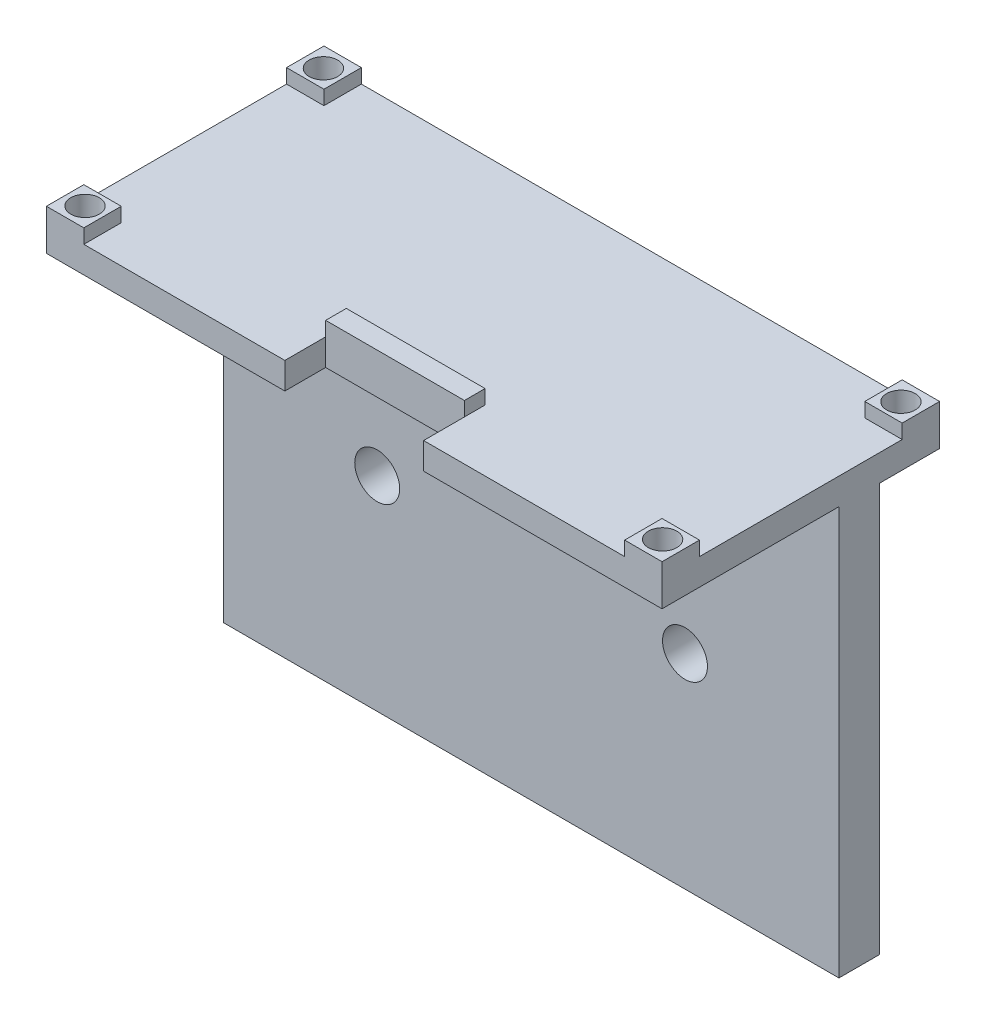
ISO-10303-21;
HEADER;
FILE_DESCRIPTION(('STEP AP214'),'2;1');
FILE_NAME('part.step','',(''),(''),'','','');
FILE_SCHEMA(('AUTOMOTIVE_DESIGN { 1 0 10303 214 1 1 1 1 }'));
ENDSEC;
DATA;
#1=APPLICATION_CONTEXT('core data for automotive mechanical design processes');
#2=APPLICATION_PROTOCOL_DEFINITION('international standard','automotive_design',2000,#1);
#3=PRODUCT_CONTEXT('',#1,'mechanical');
#4=PRODUCT('Part','Part','',(#3));
#5=PRODUCT_RELATED_PRODUCT_CATEGORY('part','',(#4));
#6=PRODUCT_DEFINITION_FORMATION('','',#4);
#7=PRODUCT_DEFINITION_CONTEXT('part definition',#1,'design');
#8=PRODUCT_DEFINITION('design','',#6,#7);
#9=PRODUCT_DEFINITION_SHAPE('','',#8);
#10=(LENGTH_UNIT() NAMED_UNIT(*) SI_UNIT(.MILLI.,.METRE.));
#11=(NAMED_UNIT(*) PLANE_ANGLE_UNIT() SI_UNIT($,.RADIAN.));
#12=(NAMED_UNIT(*) SI_UNIT($,.STERADIAN.) SOLID_ANGLE_UNIT());
#13=UNCERTAINTY_MEASURE_WITH_UNIT(LENGTH_MEASURE(1.E-05),#10,'distance_accuracy_value','');
#14=(GEOMETRIC_REPRESENTATION_CONTEXT(3) GLOBAL_UNCERTAINTY_ASSIGNED_CONTEXT((#13)) GLOBAL_UNIT_ASSIGNED_CONTEXT((#10,
#11,#12)) REPRESENTATION_CONTEXT('',''));
#15=CARTESIAN_POINT('',(0.,0.,0.));
#16=DIRECTION('',(0.,0.,1.));
#17=DIRECTION('',(1.,0.,0.));
#18=AXIS2_PLACEMENT_3D('',#15,#16,#17);
#19=CARTESIAN_POINT('',(0.,-30.,0.));
#20=DIRECTION('',(0.,-1.,0.));
#21=DIRECTION('',(0.,0.,-1.));
#22=AXIS2_PLACEMENT_3D('',#19,#20,#21);
#23=PLANE('',#22);
#24=DIRECTION('',(0.,0.,-1.));
#25=VECTOR('',#24,1.);
#26=CARTESIAN_POINT('',(0.,-30.,-3.));
#27=LINE('',#26,#25);
#28=CARTESIAN_POINT('',(0.,-30.,-13.));
#29=VERTEX_POINT('',#28);
#30=CARTESIAN_POINT('',(0.,-30.,-16.));
#31=VERTEX_POINT('',#30);
#32=EDGE_CURVE('E269',#29,#31,#27,.T.);
#33=ORIENTED_EDGE('',*,*,#32,.T.);
#34=DIRECTION('',(-1.,0.,0.));
#35=VECTOR('',#34,1.);
#36=CARTESIAN_POINT('',(0.,-30.,-16.));
#37=LINE('',#36,#35);
#38=CARTESIAN_POINT('',(45.25,-30.,-16.));
#39=VERTEX_POINT('',#38);
#40=EDGE_CURVE('E251',#39,#31,#37,.T.);
#41=ORIENTED_EDGE('',*,*,#40,.F.);
#42=DIRECTION('',(0.,0.,1.));
#43=VECTOR('',#42,1.);
#44=CARTESIAN_POINT('',(45.25,-30.,-18.));
#45=LINE('',#44,#43);
#46=CARTESIAN_POINT('',(45.25,-30.,-13.));
#47=VERTEX_POINT('',#46);
#48=EDGE_CURVE('E273',#39,#47,#45,.T.);
#49=ORIENTED_EDGE('',*,*,#48,.T.);
#50=DIRECTION('',(1.,0.,0.));
#51=VECTOR('',#50,1.);
#52=CARTESIAN_POINT('',(0.,-30.,-13.));
#53=LINE('',#52,#51);
#54=EDGE_CURVE('E261',#29,#47,#53,.T.);
#55=ORIENTED_EDGE('',*,*,#54,.F.);
#56=EDGE_LOOP('',(#33,#41,#49,#55));
#57=FACE_BOUND('',#56,.T.);
#58=ADVANCED_FACE('F45',(#57),#23,.T.);
#59=CARTESIAN_POINT('',(33.9375,-15.,0.));
#60=DIRECTION('',(0.,0.,-1.));
#61=DIRECTION('',(-1.,0.,0.));
#62=AXIS2_PLACEMENT_3D('',#59,#60,#61);
#63=CYLINDRICAL_SURFACE('',#62,1.65);
#64=CARTESIAN_POINT('',(33.9375,-15.,-13.));
#65=DIRECTION('',(0.,0.,-1.));
#66=DIRECTION('',(-1.,0.,0.));
#67=AXIS2_PLACEMENT_3D('',#64,#65,#66);
#68=CIRCLE('',#67,1.65);
#69=CARTESIAN_POINT('',(32.2875,-15.,-13.));
#70=VERTEX_POINT('',#69);
#71=EDGE_CURVE('E259',#70,#70,#68,.T.);
#72=ORIENTED_EDGE('',*,*,#71,.F.);
#73=EDGE_LOOP('',(#72));
#74=FACE_BOUND('',#73,.T.);
#75=CARTESIAN_POINT('',(33.9375,-15.,-16.));
#76=DIRECTION('',(0.,0.,-1.));
#77=DIRECTION('',(-1.,0.,0.));
#78=AXIS2_PLACEMENT_3D('',#75,#76,#77);
#79=CIRCLE('',#78,1.65);
#80=CARTESIAN_POINT('',(32.2875,-15.,-16.));
#81=VERTEX_POINT('',#80);
#82=EDGE_CURVE('E256',#81,#81,#79,.F.);
#83=ORIENTED_EDGE('',*,*,#82,.F.);
#84=EDGE_LOOP('',(#83));
#85=FACE_BOUND('',#84,.T.);
#86=ADVANCED_FACE('F472',(#74,#85),#63,.F.);
#87=CARTESIAN_POINT('',(11.3125,-15.,0.));
#88=DIRECTION('',(0.,0.,-1.));
#89=DIRECTION('',(-1.,0.,0.));
#90=AXIS2_PLACEMENT_3D('',#87,#88,#89);
#91=CYLINDRICAL_SURFACE('',#90,1.65);
#92=CARTESIAN_POINT('',(11.3125,-15.,-13.));
#93=DIRECTION('',(0.,0.,-1.));
#94=DIRECTION('',(-1.,0.,0.));
#95=AXIS2_PLACEMENT_3D('',#92,#93,#94);
#96=CIRCLE('',#95,1.65);
#97=CARTESIAN_POINT('',(9.6625,-15.,-13.));
#98=VERTEX_POINT('',#97);
#99=EDGE_CURVE('E271',#98,#98,#96,.T.);
#100=ORIENTED_EDGE('',*,*,#99,.F.);
#101=EDGE_LOOP('',(#100));
#102=FACE_BOUND('',#101,.T.);
#103=CARTESIAN_POINT('',(11.3125,-15.,-16.));
#104=DIRECTION('',(0.,0.,-1.));
#105=DIRECTION('',(-1.,0.,0.));
#106=AXIS2_PLACEMENT_3D('',#103,#104,#105);
#107=CIRCLE('',#106,1.65);
#108=CARTESIAN_POINT('',(9.6625,-15.,-16.));
#109=VERTEX_POINT('',#108);
#110=EDGE_CURVE('E49',#109,#109,#107,.F.);
#111=ORIENTED_EDGE('',*,*,#110,.F.);
#112=EDGE_LOOP('',(#111));
#113=FACE_BOUND('',#112,.T.);
#114=ADVANCED_FACE('F468',(#102,#113),#91,.F.);
#115=CARTESIAN_POINT('',(0.,0.,0.));
#116=DIRECTION('',(0.,-1.,0.));
#117=DIRECTION('',(0.,0.,-1.));
#118=AXIS2_PLACEMENT_3D('',#115,#116,#117);
#119=PLANE('',#118);
#120=DIRECTION('',(0.,0.,1.));
#121=VECTOR('',#120,1.);
#122=CARTESIAN_POINT('',(0.,0.,0.));
#123=LINE('',#122,#121);
#124=CARTESIAN_POINT('',(0.,0.,-13.));
#125=VERTEX_POINT('',#124);
#126=CARTESIAN_POINT('',(0.,0.,0.));
#127=VERTEX_POINT('',#126);
#128=EDGE_CURVE('E242',#125,#127,#123,.T.);
#129=ORIENTED_EDGE('',*,*,#128,.F.);
#130=DIRECTION('',(-1.,0.,0.));
#131=VECTOR('',#130,1.);
#132=CARTESIAN_POINT('',(0.,0.,-13.));
#133=LINE('',#132,#131);
#134=CARTESIAN_POINT('',(45.25,0.,-13.));
#135=VERTEX_POINT('',#134);
#136=EDGE_CURVE('E267',#135,#125,#133,.T.);
#137=ORIENTED_EDGE('',*,*,#136,.F.);
#138=DIRECTION('',(0.,0.,-1.));
#139=VECTOR('',#138,1.);
#140=CARTESIAN_POINT('',(45.25,0.,0.));
#141=LINE('',#140,#139);
#142=CARTESIAN_POINT('',(45.25,0.,0.));
#143=VERTEX_POINT('',#142);
#144=EDGE_CURVE('E448',#143,#135,#141,.T.);
#145=ORIENTED_EDGE('',*,*,#144,.F.);
#146=DIRECTION('',(1.,0.,0.));
#147=VECTOR('',#146,1.);
#148=CARTESIAN_POINT('',(0.,0.,0.));
#149=LINE('',#148,#147);
#150=CARTESIAN_POINT('',(27.725,0.,0.));
#151=VERTEX_POINT('',#150);
#152=EDGE_CURVE('E241',#151,#143,#149,.T.);
#153=ORIENTED_EDGE('',*,*,#152,.F.);
#154=DIRECTION('',(0.,0.,-1.));
#155=VECTOR('',#154,1.);
#156=CARTESIAN_POINT('',(27.725,0.,-3.));
#157=LINE('',#156,#155);
#158=CARTESIAN_POINT('',(27.725,0.,-3.));
#159=VERTEX_POINT('',#158);
#160=EDGE_CURVE('E410',#151,#159,#157,.T.);
#161=ORIENTED_EDGE('',*,*,#160,.T.);
#162=DIRECTION('',(-1.,0.,0.));
#163=VECTOR('',#162,1.);
#164=CARTESIAN_POINT('',(0.,0.,-3.));
#165=LINE('',#164,#163);
#166=CARTESIAN_POINT('',(17.525,0.,-3.));
#167=VERTEX_POINT('',#166);
#168=EDGE_CURVE('E262',#159,#167,#165,.T.);
#169=ORIENTED_EDGE('',*,*,#168,.T.);
#170=DIRECTION('',(0.,0.,1.));
#171=VECTOR('',#170,1.);
#172=CARTESIAN_POINT('',(17.525,0.,-3.));
#173=LINE('',#172,#171);
#174=CARTESIAN_POINT('',(17.525,0.,0.));
#175=VERTEX_POINT('',#174);
#176=EDGE_CURVE('E407',#167,#175,#173,.T.);
#177=ORIENTED_EDGE('',*,*,#176,.T.);
#178=EDGE_CURVE('E445',#127,#175,#149,.T.);
#179=ORIENTED_EDGE('',*,*,#178,.F.);
#180=EDGE_LOOP('',(#129,#137,#145,#153,#161,#169,#177,#179));
#181=FACE_BOUND('',#180,.T.);
#182=CARTESIAN_POINT('',(1.4,0.,-1.44));
#183=DIRECTION('',(0.,1.,0.));
#184=DIRECTION('',(0.,0.,1.));
#185=AXIS2_PLACEMENT_3D('',#182,#183,#184);
#186=CIRCLE('',#185,1.05);
#187=CARTESIAN_POINT('',(1.4,0.,-0.389999999999996));
#188=VERTEX_POINT('',#187);
#189=EDGE_CURVE('E275',#188,#188,#186,.T.);
#190=ORIENTED_EDGE('',*,*,#189,.T.);
#191=EDGE_LOOP('',(#190));
#192=FACE_BOUND('',#191,.T.);
#193=CARTESIAN_POINT('',(43.85,0.,-1.43999999999999));
#194=DIRECTION('',(0.,1.,0.));
#195=DIRECTION('',(0.,0.,-1.));
#196=AXIS2_PLACEMENT_3D('',#193,#194,#195);
#197=CIRCLE('',#196,1.05);
#198=CARTESIAN_POINT('',(43.85,0.,-2.49));
#199=VERTEX_POINT('',#198);
#200=EDGE_CURVE('E286',#199,#199,#197,.T.);
#201=ORIENTED_EDGE('',*,*,#200,.T.);
#202=EDGE_LOOP('',(#201));
#203=FACE_BOUND('',#202,.T.);
#204=ADVANCED_FACE('F471',(#181,#192,#203),#119,.T.);
#205=CARTESIAN_POINT('',(0.,3.,0.));
#206=DIRECTION('',(0.,-1.,0.));
#207=DIRECTION('',(0.,0.,-1.));
#208=AXIS2_PLACEMENT_3D('',#205,#206,#207);
#209=PLANE('',#208);
#210=CARTESIAN_POINT('',(43.85,3.,-18.96));
#211=DIRECTION('',(0.,1.,0.));
#212=DIRECTION('',(0.,0.,1.));
#213=AXIS2_PLACEMENT_3D('',#210,#211,#212);
#214=CIRCLE('',#213,1.05);
#215=CARTESIAN_POINT('',(43.85,3.,-17.91));
#216=VERTEX_POINT('',#215);
#217=EDGE_CURVE('E285',#216,#216,#214,.T.);
#218=ORIENTED_EDGE('',*,*,#217,.F.);
#219=EDGE_LOOP('',(#218));
#220=FACE_BOUND('',#219,.T.);
#221=DIRECTION('',(-1.,0.,0.));
#222=VECTOR('',#221,1.);
#223=CARTESIAN_POINT('',(0.,3.,-20.4));
#224=LINE('',#223,#222);
#225=CARTESIAN_POINT('',(45.25,3.,-20.4));
#226=VERTEX_POINT('',#225);
#227=CARTESIAN_POINT('',(42.5,3.,-20.4));
#228=VERTEX_POINT('',#227);
#229=EDGE_CURVE('E442',#226,#228,#224,.T.);
#230=ORIENTED_EDGE('',*,*,#229,.T.);
#231=DIRECTION('',(0.,0.,-1.));
#232=VECTOR('',#231,1.);
#233=CARTESIAN_POINT('',(42.5,3.,-20.4));
#234=LINE('',#233,#232);
#235=CARTESIAN_POINT('',(42.5,3.,-17.65));
#236=VERTEX_POINT('',#235);
#237=EDGE_CURVE('E304',#236,#228,#234,.T.);
#238=ORIENTED_EDGE('',*,*,#237,.F.);
#239=DIRECTION('',(-1.,0.,0.));
#240=VECTOR('',#239,1.);
#241=CARTESIAN_POINT('',(42.5,3.,-17.65));
#242=LINE('',#241,#240);
#243=CARTESIAN_POINT('',(45.25,3.,-17.65));
#244=VERTEX_POINT('',#243);
#245=EDGE_CURVE('E370',#244,#236,#242,.T.);
#246=ORIENTED_EDGE('',*,*,#245,.F.);
#247=DIRECTION('',(0.,0.,-1.));
#248=VECTOR('',#247,1.);
#249=CARTESIAN_POINT('',(45.25,3.,0.));
#250=LINE('',#249,#248);
#251=EDGE_CURVE('E437',#244,#226,#250,.T.);
#252=ORIENTED_EDGE('',*,*,#251,.T.);
#253=EDGE_LOOP('',(#230,#238,#246,#252));
#254=FACE_BOUND('',#253,.T.);
#255=ADVANCED_FACE('F574',(#220,#254),#209,.F.);
#256=CARTESIAN_POINT('',(43.85,3.,-1.43999999999999));
#257=DIRECTION('',(0.,1.,0.));
#258=DIRECTION('',(0.,0.,-1.));
#259=AXIS2_PLACEMENT_3D('',#256,#257,#258);
#260=CIRCLE('',#259,1.05);
#261=CARTESIAN_POINT('',(43.85,3.,-2.49));
#262=VERTEX_POINT('',#261);
#263=EDGE_CURVE('E282',#262,#262,#260,.T.);
#264=ORIENTED_EDGE('',*,*,#263,.F.);
#265=EDGE_LOOP('',(#264));
#266=FACE_BOUND('',#265,.T.);
#267=CARTESIAN_POINT('',(45.25,3.,0.));
#268=VERTEX_POINT('',#267);
#269=CARTESIAN_POINT('',(45.25,3.,-2.75000000000001));
#270=VERTEX_POINT('',#269);
#271=EDGE_CURVE('E438',#268,#270,#250,.T.);
#272=ORIENTED_EDGE('',*,*,#271,.T.);
#273=DIRECTION('',(1.,0.,0.));
#274=VECTOR('',#273,1.);
#275=CARTESIAN_POINT('',(45.25,3.,-2.75000000000001));
#276=LINE('',#275,#274);
#277=CARTESIAN_POINT('',(42.5,3.,-2.75));
#278=VERTEX_POINT('',#277);
#279=EDGE_CURVE('E368',#278,#270,#276,.T.);
#280=ORIENTED_EDGE('',*,*,#279,.F.);
#281=DIRECTION('',(0.,0.,-1.));
#282=VECTOR('',#281,1.);
#283=CARTESIAN_POINT('',(42.5,3.,-2.75));
#284=LINE('',#283,#282);
#285=CARTESIAN_POINT('',(42.5,3.,0.));
#286=VERTEX_POINT('',#285);
#287=EDGE_CURVE('E365',#286,#278,#284,.T.);
#288=ORIENTED_EDGE('',*,*,#287,.F.);
#289=DIRECTION('',(1.,0.,0.));
#290=VECTOR('',#289,1.);
#291=CARTESIAN_POINT('',(0.,3.,0.));
#292=LINE('',#291,#290);
#293=EDGE_CURVE('E432',#286,#268,#292,.T.);
#294=ORIENTED_EDGE('',*,*,#293,.T.);
#295=EDGE_LOOP('',(#272,#280,#288,#294));
#296=FACE_BOUND('',#295,.T.);
#297=ADVANCED_FACE('F657',(#266,#296),#209,.F.);
#298=DIRECTION('',(-1.,0.,0.));
#299=VECTOR('',#298,1.);
#300=CARTESIAN_POINT('',(17.525,3.,-3.));
#301=LINE('',#300,#299);
#302=CARTESIAN_POINT('',(27.725,3.,-3.));
#303=VERTEX_POINT('',#302);
#304=CARTESIAN_POINT('',(17.525,3.,-3.));
#305=VERTEX_POINT('',#304);
#306=EDGE_CURVE('E377',#303,#305,#301,.T.);
#307=ORIENTED_EDGE('',*,*,#306,.F.);
#308=DIRECTION('',(0.,0.,1.));
#309=VECTOR('',#308,1.);
#310=CARTESIAN_POINT('',(27.725,3.,0.));
#311=LINE('',#310,#309);
#312=CARTESIAN_POINT('',(27.725,3.,-4.51852131990204));
#313=VERTEX_POINT('',#312);
#314=EDGE_CURVE('E363',#313,#303,#311,.T.);
#315=ORIENTED_EDGE('',*,*,#314,.F.);
#316=DIRECTION('',(1.,0.,0.));
#317=VECTOR('',#316,1.);
#318=CARTESIAN_POINT('',(27.725,3.,-4.51852131990204));
#319=LINE('',#318,#317);
#320=CARTESIAN_POINT('',(17.525,3.,-4.51852131990204));
#321=VERTEX_POINT('',#320);
#322=EDGE_CURVE('E360',#321,#313,#319,.T.);
#323=ORIENTED_EDGE('',*,*,#322,.F.);
#324=DIRECTION('',(0.,0.,-1.));
#325=VECTOR('',#324,1.);
#326=CARTESIAN_POINT('',(17.525,3.,0.));
#327=LINE('',#326,#325);
#328=EDGE_CURVE('E358',#305,#321,#327,.T.);
#329=ORIENTED_EDGE('',*,*,#328,.F.);
#330=EDGE_LOOP('',(#307,#315,#323,#329));
#331=FACE_BOUND('',#330,.T.);
#332=ADVANCED_FACE('F598',(#331),#209,.F.);
#333=CARTESIAN_POINT('',(1.4,3.,-1.44));
#334=DIRECTION('',(0.,1.,0.));
#335=DIRECTION('',(0.,0.,1.));
#336=AXIS2_PLACEMENT_3D('',#333,#334,#335);
#337=CIRCLE('',#336,1.05);
#338=CARTESIAN_POINT('',(1.4,3.,-0.389999999999996));
#339=VERTEX_POINT('',#338);
#340=EDGE_CURVE('E276',#339,#339,#337,.T.);
#341=ORIENTED_EDGE('',*,*,#340,.F.);
#342=EDGE_LOOP('',(#341));
#343=FACE_BOUND('',#342,.T.);
#344=CARTESIAN_POINT('',(0.,3.,0.));
#345=VERTEX_POINT('',#344);
#346=CARTESIAN_POINT('',(2.75,3.,0.));
#347=VERTEX_POINT('',#346);
#348=EDGE_CURVE('E434',#345,#347,#292,.T.);
#349=ORIENTED_EDGE('',*,*,#348,.T.);
#350=DIRECTION('',(0.,0.,1.));
#351=VECTOR('',#350,1.);
#352=CARTESIAN_POINT('',(2.75,3.,-2.75));
#353=LINE('',#352,#351);
#354=CARTESIAN_POINT('',(2.75,3.,-2.75));
#355=VERTEX_POINT('',#354);
#356=EDGE_CURVE('E356',#355,#347,#353,.T.);
#357=ORIENTED_EDGE('',*,*,#356,.F.);
#358=DIRECTION('',(1.,0.,0.));
#359=VECTOR('',#358,1.);
#360=CARTESIAN_POINT('',(0.,3.,-2.75));
#361=LINE('',#360,#359);
#362=CARTESIAN_POINT('',(0.,3.,-2.75));
#363=VERTEX_POINT('',#362);
#364=EDGE_CURVE('E353',#363,#355,#361,.T.);
#365=ORIENTED_EDGE('',*,*,#364,.F.);
#366=DIRECTION('',(0.,0.,1.));
#367=VECTOR('',#366,1.);
#368=CARTESIAN_POINT('',(0.,3.,0.));
#369=LINE('',#368,#367);
#370=EDGE_CURVE('E433',#363,#345,#369,.T.);
#371=ORIENTED_EDGE('',*,*,#370,.T.);
#372=EDGE_LOOP('',(#349,#357,#365,#371));
#373=FACE_BOUND('',#372,.T.);
#374=ADVANCED_FACE('F575',(#343,#373),#209,.F.);
#375=CARTESIAN_POINT('',(0.,3.,0.));
#376=DIRECTION('',(0.,0.,-1.));
#377=DIRECTION('',(-1.,0.,0.));
#378=AXIS2_PLACEMENT_3D('',#375,#376,#377);
#379=PLANE('',#378);
#380=DIRECTION('',(1.,0.,0.));
#381=VECTOR('',#380,1.);
#382=CARTESIAN_POINT('',(2.75,1.95,0.));
#383=LINE('',#382,#381);
#384=CARTESIAN_POINT('',(2.75,1.95,0.));
#385=VERTEX_POINT('',#384);
#386=CARTESIAN_POINT('',(17.525,1.95,0.));
#387=VERTEX_POINT('',#386);
#388=EDGE_CURVE('E319',#385,#387,#383,.T.);
#389=ORIENTED_EDGE('',*,*,#388,.F.);
#390=DIRECTION('',(0.,1.,0.));
#391=VECTOR('',#390,1.);
#392=CARTESIAN_POINT('',(2.75,1.95,0.));
#393=LINE('',#392,#391);
#394=EDGE_CURVE('E394',#385,#347,#393,.T.);
#395=ORIENTED_EDGE('',*,*,#394,.T.);
#396=ORIENTED_EDGE('',*,*,#348,.F.);
#397=DIRECTION('',(0.,-1.,0.));
#398=VECTOR('',#397,1.);
#399=CARTESIAN_POINT('',(0.,3.,0.));
#400=LINE('',#399,#398);
#401=EDGE_CURVE('E54',#345,#127,#400,.T.);
#402=ORIENTED_EDGE('',*,*,#401,.T.);
#403=ORIENTED_EDGE('',*,*,#178,.T.);
#404=DIRECTION('',(0.,1.,0.));
#405=VECTOR('',#404,1.);
#406=CARTESIAN_POINT('',(17.525,0.,0.));
#407=LINE('',#406,#405);
#408=EDGE_CURVE('E413',#175,#387,#407,.T.);
#409=ORIENTED_EDGE('',*,*,#408,.T.);
#410=EDGE_LOOP('',(#389,#395,#396,#402,#403,#409));
#411=FACE_BOUND('',#410,.T.);
#412=ADVANCED_FACE('F587',(#411),#379,.F.);
#413=CARTESIAN_POINT('',(0.,3.,0.));
#414=DIRECTION('',(1.,0.,0.));
#415=DIRECTION('',(0.,0.,-1.));
#416=AXIS2_PLACEMENT_3D('',#413,#414,#415);
#417=PLANE('',#416);
#418=CARTESIAN_POINT('',(0.,0.,-20.4));
#419=VERTEX_POINT('',#418);
#420=CARTESIAN_POINT('',(0.,0.,-16.));
#421=VERTEX_POINT('',#420);
#422=EDGE_CURVE('E230',#419,#421,#123,.T.);
#423=ORIENTED_EDGE('',*,*,#422,.T.);
#424=DIRECTION('',(0.,1.,0.));
#425=VECTOR('',#424,1.);
#426=CARTESIAN_POINT('',(0.,-30.,-16.));
#427=LINE('',#426,#425);
#428=EDGE_CURVE('E234',#31,#421,#427,.T.);
#429=ORIENTED_EDGE('',*,*,#428,.F.);
#430=ORIENTED_EDGE('',*,*,#32,.F.);
#431=DIRECTION('',(0.,-1.,0.));
#432=VECTOR('',#431,1.);
#433=CARTESIAN_POINT('',(0.,-30.,-13.));
#434=LINE('',#433,#432);
#435=EDGE_CURVE('E70',#125,#29,#434,.T.);
#436=ORIENTED_EDGE('',*,*,#435,.F.);
#437=ORIENTED_EDGE('',*,*,#128,.T.);
#438=ORIENTED_EDGE('',*,*,#401,.F.);
#439=ORIENTED_EDGE('',*,*,#370,.F.);
#440=DIRECTION('',(0.,1.,0.));
#441=VECTOR('',#440,1.);
#442=CARTESIAN_POINT('',(0.,1.95,-2.75));
#443=LINE('',#442,#441);
#444=CARTESIAN_POINT('',(0.,1.95,-2.75));
#445=VERTEX_POINT('',#444);
#446=EDGE_CURVE('E399',#445,#363,#443,.T.);
#447=ORIENTED_EDGE('',*,*,#446,.F.);
#448=DIRECTION('',(0.,0.,1.));
#449=VECTOR('',#448,1.);
#450=CARTESIAN_POINT('',(0.,1.95,-17.65));
#451=LINE('',#450,#449);
#452=CARTESIAN_POINT('',(0.,1.95,-17.65));
#453=VERTEX_POINT('',#452);
#454=EDGE_CURVE('E310',#453,#445,#451,.T.);
#455=ORIENTED_EDGE('',*,*,#454,.F.);
#456=DIRECTION('',(0.,1.,0.));
#457=VECTOR('',#456,1.);
#458=CARTESIAN_POINT('',(0.,1.95,-17.65));
#459=LINE('',#458,#457);
#460=CARTESIAN_POINT('',(0.,3.,-17.65));
#461=VERTEX_POINT('',#460);
#462=EDGE_CURVE('E401',#453,#461,#459,.T.);
#463=ORIENTED_EDGE('',*,*,#462,.T.);
#464=CARTESIAN_POINT('',(0.,3.,-20.4));
#465=VERTEX_POINT('',#464);
#466=EDGE_CURVE('E429',#465,#461,#369,.T.);
#467=ORIENTED_EDGE('',*,*,#466,.F.);
#468=DIRECTION('',(0.,-1.,0.));
#469=VECTOR('',#468,1.);
#470=CARTESIAN_POINT('',(0.,3.,-20.4));
#471=LINE('',#470,#469);
#472=EDGE_CURVE('E238',#465,#419,#471,.T.);
#473=ORIENTED_EDGE('',*,*,#472,.T.);
#474=EDGE_LOOP('',(#423,#429,#430,#436,#437,#438,#439,#447,#455,#463,#467,#473));
#475=FACE_BOUND('',#474,.T.);
#476=ADVANCED_FACE('F47',(#475),#417,.F.);
#477=ORIENTED_EDGE('',*,*,#293,.F.);
#478=DIRECTION('',(0.,1.,0.));
#479=VECTOR('',#478,1.);
#480=CARTESIAN_POINT('',(42.5,1.95,0.));
#481=LINE('',#480,#479);
#482=CARTESIAN_POINT('',(42.5,1.95,0.));
#483=VERTEX_POINT('',#482);
#484=EDGE_CURVE('E387',#483,#286,#481,.T.);
#485=ORIENTED_EDGE('',*,*,#484,.F.);
#486=DIRECTION('',(1.,0.,0.));
#487=VECTOR('',#486,1.);
#488=CARTESIAN_POINT('',(42.5,1.95,0.));
#489=LINE('',#488,#487);
#490=CARTESIAN_POINT('',(27.725,1.95,0.));
#491=VERTEX_POINT('',#490);
#492=EDGE_CURVE('E330',#491,#483,#489,.T.);
#493=ORIENTED_EDGE('',*,*,#492,.F.);
#494=DIRECTION('',(0.,1.,0.));
#495=VECTOR('',#494,1.);
#496=CARTESIAN_POINT('',(27.725,0.,0.));
#497=LINE('',#496,#495);
#498=EDGE_CURVE('E424',#151,#491,#497,.T.);
#499=ORIENTED_EDGE('',*,*,#498,.F.);
#500=ORIENTED_EDGE('',*,*,#152,.T.);
#501=DIRECTION('',(0.,-1.,0.));
#502=VECTOR('',#501,1.);
#503=CARTESIAN_POINT('',(45.25,3.,0.));
#504=LINE('',#503,#502);
#505=EDGE_CURVE('E456',#268,#143,#504,.T.);
#506=ORIENTED_EDGE('',*,*,#505,.F.);
#507=EDGE_LOOP('',(#477,#485,#493,#499,#500,#506));
#508=FACE_BOUND('',#507,.T.);
#509=ADVANCED_FACE('F583',(#508),#379,.F.);
#510=CARTESIAN_POINT('',(45.25,3.,0.));
#511=DIRECTION('',(-1.,0.,0.));
#512=DIRECTION('',(0.,0.,1.));
#513=AXIS2_PLACEMENT_3D('',#510,#511,#512);
#514=PLANE('',#513);
#515=DIRECTION('',(0.,-1.,0.));
#516=VECTOR('',#515,1.);
#517=CARTESIAN_POINT('',(45.25,-30.,-16.));
#518=LINE('',#517,#516);
#519=CARTESIAN_POINT('',(45.25,0.,-16.));
#520=VERTEX_POINT('',#519);
#521=EDGE_CURVE('E62',#520,#39,#518,.T.);
#522=ORIENTED_EDGE('',*,*,#521,.F.);
#523=CARTESIAN_POINT('',(45.25,0.,-20.4));
#524=VERTEX_POINT('',#523);
#525=EDGE_CURVE('E247',#520,#524,#141,.T.);
#526=ORIENTED_EDGE('',*,*,#525,.T.);
#527=DIRECTION('',(0.,-1.,0.));
#528=VECTOR('',#527,1.);
#529=CARTESIAN_POINT('',(45.25,3.,-20.4));
#530=LINE('',#529,#528);
#531=EDGE_CURVE('E453',#226,#524,#530,.T.);
#532=ORIENTED_EDGE('',*,*,#531,.F.);
#533=ORIENTED_EDGE('',*,*,#251,.F.);
#534=DIRECTION('',(0.,1.,0.));
#535=VECTOR('',#534,1.);
#536=CARTESIAN_POINT('',(45.25,1.95,-17.65));
#537=LINE('',#536,#535);
#538=CARTESIAN_POINT('',(45.25,1.95,-17.65));
#539=VERTEX_POINT('',#538);
#540=EDGE_CURVE('E380',#539,#244,#537,.T.);
#541=ORIENTED_EDGE('',*,*,#540,.F.);
#542=DIRECTION('',(0.,0.,-1.));
#543=VECTOR('',#542,1.);
#544=CARTESIAN_POINT('',(45.25,1.95,-2.75000000000001));
#545=LINE('',#544,#543);
#546=CARTESIAN_POINT('',(45.25,1.95,-2.75000000000001));
#547=VERTEX_POINT('',#546);
#548=EDGE_CURVE('E339',#547,#539,#545,.T.);
#549=ORIENTED_EDGE('',*,*,#548,.F.);
#550=DIRECTION('',(0.,1.,0.));
#551=VECTOR('',#550,1.);
#552=CARTESIAN_POINT('',(45.25,1.95,-2.75000000000001));
#553=LINE('',#552,#551);
#554=EDGE_CURVE('E382',#547,#270,#553,.T.);
#555=ORIENTED_EDGE('',*,*,#554,.T.);
#556=ORIENTED_EDGE('',*,*,#271,.F.);
#557=ORIENTED_EDGE('',*,*,#505,.T.);
#558=ORIENTED_EDGE('',*,*,#144,.T.);
#559=DIRECTION('',(0.,1.,0.));
#560=VECTOR('',#559,1.);
#561=CARTESIAN_POINT('',(45.25,-30.,-13.));
#562=LINE('',#561,#560);
#563=EDGE_CURVE('E264',#47,#135,#562,.T.);
#564=ORIENTED_EDGE('',*,*,#563,.F.);
#565=ORIENTED_EDGE('',*,*,#48,.F.);
#566=EDGE_LOOP('',(#522,#526,#532,#533,#541,#549,#555,#556,#557,#558,#564,#565));
#567=FACE_BOUND('',#566,.T.);
#568=ADVANCED_FACE('F580',(#567),#514,.F.);
#569=CARTESIAN_POINT('',(0.,3.,-20.4));
#570=DIRECTION('',(0.,0.,1.));
#571=DIRECTION('',(1.,0.,0.));
#572=AXIS2_PLACEMENT_3D('',#569,#570,#571);
#573=PLANE('',#572);
#574=DIRECTION('',(-1.,0.,0.));
#575=VECTOR('',#574,1.);
#576=CARTESIAN_POINT('',(2.75,1.95,-20.4));
#577=LINE('',#576,#575);
#578=CARTESIAN_POINT('',(42.5,1.95,-20.4));
#579=VERTEX_POINT('',#578);
#580=CARTESIAN_POINT('',(2.75,1.95,-20.4));
#581=VERTEX_POINT('',#580);
#582=EDGE_CURVE('E300',#579,#581,#577,.T.);
#583=ORIENTED_EDGE('',*,*,#582,.F.);
#584=DIRECTION('',(0.,1.,0.));
#585=VECTOR('',#584,1.);
#586=CARTESIAN_POINT('',(42.5,1.95,-20.4));
#587=LINE('',#586,#585);
#588=EDGE_CURVE('E374',#579,#228,#587,.T.);
#589=ORIENTED_EDGE('',*,*,#588,.T.);
#590=ORIENTED_EDGE('',*,*,#229,.F.);
#591=ORIENTED_EDGE('',*,*,#531,.T.);
#592=DIRECTION('',(-1.,0.,0.));
#593=VECTOR('',#592,1.);
#594=CARTESIAN_POINT('',(0.,0.,-20.4));
#595=LINE('',#594,#593);
#596=EDGE_CURVE('E450',#524,#419,#595,.T.);
#597=ORIENTED_EDGE('',*,*,#596,.T.);
#598=ORIENTED_EDGE('',*,*,#472,.F.);
#599=CARTESIAN_POINT('',(2.75,3.,-20.4));
#600=VERTEX_POINT('',#599);
#601=EDGE_CURVE('E441',#600,#465,#224,.T.);
#602=ORIENTED_EDGE('',*,*,#601,.F.);
#603=DIRECTION('',(0.,1.,0.));
#604=VECTOR('',#603,1.);
#605=CARTESIAN_POINT('',(2.75,1.95,-20.4));
#606=LINE('',#605,#604);
#607=EDGE_CURVE('E348',#581,#600,#606,.T.);
#608=ORIENTED_EDGE('',*,*,#607,.F.);
#609=EDGE_LOOP('',(#583,#589,#590,#591,#597,#598,#602,#608));
#610=FACE_BOUND('',#609,.T.);
#611=ADVANCED_FACE('F572',(#610),#573,.F.);
#612=CARTESIAN_POINT('',(1.4,3.,-18.96));
#613=DIRECTION('',(0.,1.,0.));
#614=DIRECTION('',(0.,0.,-1.));
#615=AXIS2_PLACEMENT_3D('',#612,#613,#614);
#616=CIRCLE('',#615,1.05);
#617=CARTESIAN_POINT('',(1.4,3.,-20.01));
#618=VERTEX_POINT('',#617);
#619=EDGE_CURVE('E289',#618,#618,#616,.T.);
#620=ORIENTED_EDGE('',*,*,#619,.F.);
#621=EDGE_LOOP('',(#620));
#622=FACE_BOUND('',#621,.T.);
#623=ORIENTED_EDGE('',*,*,#466,.T.);
#624=DIRECTION('',(-1.,0.,0.));
#625=VECTOR('',#624,1.);
#626=CARTESIAN_POINT('',(2.75,3.,-17.65));
#627=LINE('',#626,#625);
#628=CARTESIAN_POINT('',(2.75,3.,-17.65));
#629=VERTEX_POINT('',#628);
#630=EDGE_CURVE('E351',#629,#461,#627,.T.);
#631=ORIENTED_EDGE('',*,*,#630,.F.);
#632=DIRECTION('',(0.,0.,1.));
#633=VECTOR('',#632,1.);
#634=CARTESIAN_POINT('',(2.75,3.,-20.4));
#635=LINE('',#634,#633);
#636=EDGE_CURVE('E297',#600,#629,#635,.T.);
#637=ORIENTED_EDGE('',*,*,#636,.F.);
#638=ORIENTED_EDGE('',*,*,#601,.T.);
#639=EDGE_LOOP('',(#623,#631,#637,#638));
#640=FACE_BOUND('',#639,.T.);
#641=ADVANCED_FACE('F569',(#622,#640),#209,.F.);
#642=ORIENTED_EDGE('',*,*,#525,.F.);
#643=DIRECTION('',(1.,0.,0.));
#644=VECTOR('',#643,1.);
#645=CARTESIAN_POINT('',(0.,0.,-16.));
#646=LINE('',#645,#644);
#647=EDGE_CURVE('E244',#421,#520,#646,.T.);
#648=ORIENTED_EDGE('',*,*,#647,.F.);
#649=ORIENTED_EDGE('',*,*,#422,.F.);
#650=ORIENTED_EDGE('',*,*,#596,.F.);
#651=EDGE_LOOP('',(#642,#648,#649,#650));
#652=FACE_BOUND('',#651,.T.);
#653=CARTESIAN_POINT('',(43.85,0.,-18.96));
#654=DIRECTION('',(0.,1.,0.));
#655=DIRECTION('',(0.,0.,1.));
#656=AXIS2_PLACEMENT_3D('',#653,#654,#655);
#657=CIRCLE('',#656,1.05);
#658=CARTESIAN_POINT('',(43.85,0.,-17.91));
#659=VERTEX_POINT('',#658);
#660=EDGE_CURVE('E294',#659,#659,#657,.T.);
#661=ORIENTED_EDGE('',*,*,#660,.T.);
#662=EDGE_LOOP('',(#661));
#663=FACE_BOUND('',#662,.T.);
#664=CARTESIAN_POINT('',(1.4,0.,-18.96));
#665=DIRECTION('',(0.,1.,0.));
#666=DIRECTION('',(0.,0.,-1.));
#667=AXIS2_PLACEMENT_3D('',#664,#665,#666);
#668=CIRCLE('',#667,1.05);
#669=CARTESIAN_POINT('',(1.4,0.,-20.01));
#670=VERTEX_POINT('',#669);
#671=EDGE_CURVE('E279',#670,#670,#668,.T.);
#672=ORIENTED_EDGE('',*,*,#671,.T.);
#673=EDGE_LOOP('',(#672));
#674=FACE_BOUND('',#673,.T.);
#675=ADVANCED_FACE('F245',(#652,#663,#674),#119,.T.);
#676=CARTESIAN_POINT('',(17.525,0.,-3.));
#677=DIRECTION('',(-1.,0.,0.));
#678=DIRECTION('',(0.,0.,1.));
#679=AXIS2_PLACEMENT_3D('',#676,#677,#678);
#680=PLANE('',#679);
#681=DIRECTION('',(0.,1.,0.));
#682=VECTOR('',#681,1.);
#683=CARTESIAN_POINT('',(17.525,0.,-3.));
#684=LINE('',#683,#682);
#685=CARTESIAN_POINT('',(17.525,1.95,-3.));
#686=VERTEX_POINT('',#685);
#687=EDGE_CURVE('E416',#167,#686,#684,.T.);
#688=ORIENTED_EDGE('',*,*,#687,.T.);
#689=DIRECTION('',(0.,0.,-1.));
#690=VECTOR('',#689,1.);
#691=CARTESIAN_POINT('',(17.525,1.95,0.));
#692=LINE('',#691,#690);
#693=EDGE_CURVE('E322',#387,#686,#692,.T.);
#694=ORIENTED_EDGE('',*,*,#693,.F.);
#695=ORIENTED_EDGE('',*,*,#408,.F.);
#696=ORIENTED_EDGE('',*,*,#176,.F.);
#697=EDGE_LOOP('',(#688,#694,#695,#696));
#698=FACE_BOUND('',#697,.T.);
#699=ADVANCED_FACE('F561',(#698),#680,.F.);
#700=CARTESIAN_POINT('',(17.525,0.,-3.));
#701=DIRECTION('',(0.,0.,-1.));
#702=DIRECTION('',(-1.,0.,0.));
#703=AXIS2_PLACEMENT_3D('',#700,#701,#702);
#704=PLANE('',#703);
#705=ORIENTED_EDGE('',*,*,#687,.F.);
#706=ORIENTED_EDGE('',*,*,#168,.F.);
#707=DIRECTION('',(0.,1.,0.));
#708=VECTOR('',#707,1.);
#709=CARTESIAN_POINT('',(27.725,0.,-3.));
#710=LINE('',#709,#708);
#711=CARTESIAN_POINT('',(27.725,1.95,-3.));
#712=VERTEX_POINT('',#711);
#713=EDGE_CURVE('E420',#159,#712,#710,.T.);
#714=ORIENTED_EDGE('',*,*,#713,.T.);
#715=EDGE_CURVE('E423',#712,#303,#710,.T.);
#716=ORIENTED_EDGE('',*,*,#715,.T.);
#717=ORIENTED_EDGE('',*,*,#306,.T.);
#718=EDGE_CURVE('E419',#686,#305,#684,.T.);
#719=ORIENTED_EDGE('',*,*,#718,.F.);
#720=EDGE_LOOP('',(#705,#706,#714,#716,#717,#719));
#721=FACE_BOUND('',#720,.T.);
#722=ADVANCED_FACE('F558',(#721),#704,.F.);
#723=CARTESIAN_POINT('',(27.725,0.,-3.));
#724=DIRECTION('',(1.,0.,0.));
#725=DIRECTION('',(0.,0.,-1.));
#726=AXIS2_PLACEMENT_3D('',#723,#724,#725);
#727=PLANE('',#726);
#728=ORIENTED_EDGE('',*,*,#498,.T.);
#729=DIRECTION('',(0.,0.,-1.));
#730=VECTOR('',#729,1.);
#731=CARTESIAN_POINT('',(27.725,1.95,-3.));
#732=LINE('',#731,#730);
#733=EDGE_CURVE('E11',#491,#712,#732,.T.);
#734=ORIENTED_EDGE('',*,*,#733,.T.);
#735=ORIENTED_EDGE('',*,*,#713,.F.);
#736=ORIENTED_EDGE('',*,*,#160,.F.);
#737=EDGE_LOOP('',(#728,#734,#735,#736));
#738=FACE_BOUND('',#737,.T.);
#739=ADVANCED_FACE('F535',(#738),#727,.F.);
#740=CARTESIAN_POINT('',(27.725,1.95,0.));
#741=DIRECTION('',(-1.,0.,0.));
#742=DIRECTION('',(0.,0.,1.));
#743=AXIS2_PLACEMENT_3D('',#740,#741,#742);
#744=PLANE('',#743);
#745=DIRECTION('',(0.,0.,1.));
#746=VECTOR('',#745,1.);
#747=CARTESIAN_POINT('',(27.725,1.95,0.));
#748=LINE('',#747,#746);
#749=CARTESIAN_POINT('',(27.725,1.95,-4.51852131990204));
#750=VERTEX_POINT('',#749);
#751=EDGE_CURVE('E328',#750,#712,#748,.T.);
#752=ORIENTED_EDGE('',*,*,#751,.F.);
#753=DIRECTION('',(0.,1.,0.));
#754=VECTOR('',#753,1.);
#755=CARTESIAN_POINT('',(27.725,1.95,-4.51852131990204));
#756=LINE('',#755,#754);
#757=EDGE_CURVE('E389',#750,#313,#756,.T.);
#758=ORIENTED_EDGE('',*,*,#757,.T.);
#759=ORIENTED_EDGE('',*,*,#314,.T.);
#760=ORIENTED_EDGE('',*,*,#715,.F.);
#761=EDGE_LOOP('',(#752,#758,#759,#760));
#762=FACE_BOUND('',#761,.T.);
#763=ADVANCED_FACE('F532',(#762),#744,.F.);
#764=CARTESIAN_POINT('',(17.525,1.95,0.));
#765=DIRECTION('',(1.,0.,0.));
#766=DIRECTION('',(0.,0.,-1.));
#767=AXIS2_PLACEMENT_3D('',#764,#765,#766);
#768=PLANE('',#767);
#769=ORIENTED_EDGE('',*,*,#328,.T.);
#770=DIRECTION('',(0.,1.,0.));
#771=VECTOR('',#770,1.);
#772=CARTESIAN_POINT('',(17.525,1.95,-4.51852131990204));
#773=LINE('',#772,#771);
#774=CARTESIAN_POINT('',(17.525,1.95,-4.51852131990204));
#775=VERTEX_POINT('',#774);
#776=EDGE_CURVE('E391',#775,#321,#773,.T.);
#777=ORIENTED_EDGE('',*,*,#776,.F.);
#778=EDGE_CURVE('E321',#686,#775,#692,.T.);
#779=ORIENTED_EDGE('',*,*,#778,.F.);
#780=ORIENTED_EDGE('',*,*,#718,.T.);
#781=EDGE_LOOP('',(#769,#777,#779,#780));
#782=FACE_BOUND('',#781,.T.);
#783=ADVANCED_FACE('F518',(#782),#768,.F.);
#784=CARTESIAN_POINT('',(42.5,1.95,-20.4));
#785=DIRECTION('',(1.,0.,0.));
#786=DIRECTION('',(0.,0.,-1.));
#787=AXIS2_PLACEMENT_3D('',#784,#785,#786);
#788=PLANE('',#787);
#789=ORIENTED_EDGE('',*,*,#237,.T.);
#790=ORIENTED_EDGE('',*,*,#588,.F.);
#791=DIRECTION('',(0.,0.,-1.));
#792=VECTOR('',#791,1.);
#793=CARTESIAN_POINT('',(42.5,1.95,-20.4));
#794=LINE('',#793,#792);
#795=CARTESIAN_POINT('',(42.5,1.95,-17.65));
#796=VERTEX_POINT('',#795);
#797=EDGE_CURVE('E345',#796,#579,#794,.T.);
#798=ORIENTED_EDGE('',*,*,#797,.F.);
#799=DIRECTION('',(0.,1.,0.));
#800=VECTOR('',#799,1.);
#801=CARTESIAN_POINT('',(42.5,1.95,-17.65));
#802=LINE('',#801,#800);
#803=EDGE_CURVE('E378',#796,#236,#802,.T.);
#804=ORIENTED_EDGE('',*,*,#803,.T.);
#805=EDGE_LOOP('',(#789,#790,#798,#804));
#806=FACE_BOUND('',#805,.T.);
#807=ADVANCED_FACE('F514',(#806),#788,.F.);
#808=CARTESIAN_POINT('',(42.5,1.95,-17.65));
#809=DIRECTION('',(0.,0.,-1.));
#810=DIRECTION('',(-1.,0.,0.));
#811=AXIS2_PLACEMENT_3D('',#808,#809,#810);
#812=PLANE('',#811);
#813=ORIENTED_EDGE('',*,*,#245,.T.);
#814=ORIENTED_EDGE('',*,*,#803,.F.);
#815=DIRECTION('',(-1.,0.,0.));
#816=VECTOR('',#815,1.);
#817=CARTESIAN_POINT('',(42.5,1.95,-17.65));
#818=LINE('',#817,#816);
#819=EDGE_CURVE('E342',#539,#796,#818,.T.);
#820=ORIENTED_EDGE('',*,*,#819,.F.);
#821=ORIENTED_EDGE('',*,*,#540,.T.);
#822=EDGE_LOOP('',(#813,#814,#820,#821));
#823=FACE_BOUND('',#822,.T.);
#824=ADVANCED_FACE('F517',(#823),#812,.F.);
#825=CARTESIAN_POINT('',(45.25,1.95,-2.75000000000001));
#826=DIRECTION('',(0.,0.,1.));
#827=DIRECTION('',(1.,0.,0.));
#828=AXIS2_PLACEMENT_3D('',#825,#826,#827);
#829=PLANE('',#828);
#830=ORIENTED_EDGE('',*,*,#279,.T.);
#831=ORIENTED_EDGE('',*,*,#554,.F.);
#832=DIRECTION('',(1.,0.,0.));
#833=VECTOR('',#832,1.);
#834=CARTESIAN_POINT('',(45.25,1.95,-2.75000000000001));
#835=LINE('',#834,#833);
#836=CARTESIAN_POINT('',(42.5,1.95,-2.75));
#837=VERTEX_POINT('',#836);
#838=EDGE_CURVE('E336',#837,#547,#835,.T.);
#839=ORIENTED_EDGE('',*,*,#838,.F.);
#840=DIRECTION('',(0.,1.,0.));
#841=VECTOR('',#840,1.);
#842=CARTESIAN_POINT('',(42.5,1.95,-2.75));
#843=LINE('',#842,#841);
#844=EDGE_CURVE('E385',#837,#278,#843,.T.);
#845=ORIENTED_EDGE('',*,*,#844,.T.);
#846=EDGE_LOOP('',(#830,#831,#839,#845));
#847=FACE_BOUND('',#846,.T.);
#848=ADVANCED_FACE('F522',(#847),#829,.F.);
#849=CARTESIAN_POINT('',(42.5,1.95,-2.75));
#850=DIRECTION('',(1.,0.,0.));
#851=DIRECTION('',(0.,0.,-1.));
#852=AXIS2_PLACEMENT_3D('',#849,#850,#851);
#853=PLANE('',#852);
#854=ORIENTED_EDGE('',*,*,#287,.T.);
#855=ORIENTED_EDGE('',*,*,#844,.F.);
#856=DIRECTION('',(0.,0.,-1.));
#857=VECTOR('',#856,1.);
#858=CARTESIAN_POINT('',(42.5,1.95,-2.75));
#859=LINE('',#858,#857);
#860=EDGE_CURVE('E333',#483,#837,#859,.T.);
#861=ORIENTED_EDGE('',*,*,#860,.F.);
#862=ORIENTED_EDGE('',*,*,#484,.T.);
#863=EDGE_LOOP('',(#854,#855,#861,#862));
#864=FACE_BOUND('',#863,.T.);
#865=ADVANCED_FACE('F526',(#864),#853,.F.);
#866=CARTESIAN_POINT('',(27.725,1.95,-4.51852131990204));
#867=DIRECTION('',(0.,0.,1.));
#868=DIRECTION('',(1.,0.,0.));
#869=AXIS2_PLACEMENT_3D('',#866,#867,#868);
#870=PLANE('',#869);
#871=ORIENTED_EDGE('',*,*,#322,.T.);
#872=ORIENTED_EDGE('',*,*,#757,.F.);
#873=DIRECTION('',(1.,0.,0.));
#874=VECTOR('',#873,1.);
#875=CARTESIAN_POINT('',(27.725,1.95,-4.51852131990204));
#876=LINE('',#875,#874);
#877=EDGE_CURVE('E325',#775,#750,#876,.T.);
#878=ORIENTED_EDGE('',*,*,#877,.F.);
#879=ORIENTED_EDGE('',*,*,#776,.T.);
#880=EDGE_LOOP('',(#871,#872,#878,#879));
#881=FACE_BOUND('',#880,.T.);
#882=ADVANCED_FACE('F530',(#881),#870,.F.);
#883=CARTESIAN_POINT('',(2.75,1.95,-2.75));
#884=DIRECTION('',(-1.,0.,0.));
#885=DIRECTION('',(0.,0.,1.));
#886=AXIS2_PLACEMENT_3D('',#883,#884,#885);
#887=PLANE('',#886);
#888=ORIENTED_EDGE('',*,*,#356,.T.);
#889=ORIENTED_EDGE('',*,*,#394,.F.);
#890=DIRECTION('',(0.,0.,1.));
#891=VECTOR('',#890,1.);
#892=CARTESIAN_POINT('',(2.75,1.95,-2.75));
#893=LINE('',#892,#891);
#894=CARTESIAN_POINT('',(2.75,1.95,-2.75));
#895=VERTEX_POINT('',#894);
#896=EDGE_CURVE('E316',#895,#385,#893,.T.);
#897=ORIENTED_EDGE('',*,*,#896,.F.);
#898=DIRECTION('',(0.,1.,0.));
#899=VECTOR('',#898,1.);
#900=CARTESIAN_POINT('',(2.75,1.95,-2.75));
#901=LINE('',#900,#899);
#902=EDGE_CURVE('E397',#895,#355,#901,.T.);
#903=ORIENTED_EDGE('',*,*,#902,.T.);
#904=EDGE_LOOP('',(#888,#889,#897,#903));
#905=FACE_BOUND('',#904,.T.);
#906=ADVANCED_FACE('F539',(#905),#887,.F.);
#907=CARTESIAN_POINT('',(0.,1.95,-2.75));
#908=DIRECTION('',(0.,0.,1.));
#909=DIRECTION('',(1.,0.,0.));
#910=AXIS2_PLACEMENT_3D('',#907,#908,#909);
#911=PLANE('',#910);
#912=ORIENTED_EDGE('',*,*,#364,.T.);
#913=ORIENTED_EDGE('',*,*,#902,.F.);
#914=DIRECTION('',(1.,0.,0.));
#915=VECTOR('',#914,1.);
#916=CARTESIAN_POINT('',(0.,1.95,-2.75));
#917=LINE('',#916,#915);
#918=EDGE_CURVE('E313',#445,#895,#917,.T.);
#919=ORIENTED_EDGE('',*,*,#918,.F.);
#920=ORIENTED_EDGE('',*,*,#446,.T.);
#921=EDGE_LOOP('',(#912,#913,#919,#920));
#922=FACE_BOUND('',#921,.T.);
#923=ADVANCED_FACE('F546',(#922),#911,.F.);
#924=CARTESIAN_POINT('',(2.75,1.95,-17.65));
#925=DIRECTION('',(0.,0.,-1.));
#926=DIRECTION('',(-1.,0.,0.));
#927=AXIS2_PLACEMENT_3D('',#924,#925,#926);
#928=PLANE('',#927);
#929=ORIENTED_EDGE('',*,*,#630,.T.);
#930=ORIENTED_EDGE('',*,*,#462,.F.);
#931=DIRECTION('',(-1.,0.,0.));
#932=VECTOR('',#931,1.);
#933=CARTESIAN_POINT('',(2.75,1.95,-17.65));
#934=LINE('',#933,#932);
#935=CARTESIAN_POINT('',(2.75,1.95,-17.65));
#936=VERTEX_POINT('',#935);
#937=EDGE_CURVE('E307',#936,#453,#934,.T.);
#938=ORIENTED_EDGE('',*,*,#937,.F.);
#939=DIRECTION('',(0.,1.,0.));
#940=VECTOR('',#939,1.);
#941=CARTESIAN_POINT('',(2.75,1.95,-17.65));
#942=LINE('',#941,#940);
#943=EDGE_CURVE('E404',#936,#629,#942,.T.);
#944=ORIENTED_EDGE('',*,*,#943,.T.);
#945=EDGE_LOOP('',(#929,#930,#938,#944));
#946=FACE_BOUND('',#945,.T.);
#947=ADVANCED_FACE('F550',(#946),#928,.F.);
#948=CARTESIAN_POINT('',(2.75,1.95,-20.4));
#949=DIRECTION('',(-1.,0.,0.));
#950=DIRECTION('',(0.,0.,1.));
#951=AXIS2_PLACEMENT_3D('',#948,#949,#950);
#952=PLANE('',#951);
#953=ORIENTED_EDGE('',*,*,#636,.T.);
#954=ORIENTED_EDGE('',*,*,#943,.F.);
#955=DIRECTION('',(0.,0.,1.));
#956=VECTOR('',#955,1.);
#957=CARTESIAN_POINT('',(2.75,1.95,-20.4));
#958=LINE('',#957,#956);
#959=EDGE_CURVE('E303',#581,#936,#958,.T.);
#960=ORIENTED_EDGE('',*,*,#959,.F.);
#961=ORIENTED_EDGE('',*,*,#607,.T.);
#962=EDGE_LOOP('',(#953,#954,#960,#961));
#963=FACE_BOUND('',#962,.T.);
#964=ADVANCED_FACE('F512',(#963),#952,.F.);
#965=CARTESIAN_POINT('',(0.,1.95,0.));
#966=DIRECTION('',(0.,-1.,0.));
#967=DIRECTION('',(0.,0.,-1.));
#968=AXIS2_PLACEMENT_3D('',#965,#966,#967);
#969=PLANE('',#968);
#970=ORIENTED_EDGE('',*,*,#582,.T.);
#971=ORIENTED_EDGE('',*,*,#959,.T.);
#972=ORIENTED_EDGE('',*,*,#937,.T.);
#973=ORIENTED_EDGE('',*,*,#454,.T.);
#974=ORIENTED_EDGE('',*,*,#918,.T.);
#975=ORIENTED_EDGE('',*,*,#896,.T.);
#976=ORIENTED_EDGE('',*,*,#388,.T.);
#977=ORIENTED_EDGE('',*,*,#693,.T.);
#978=ORIENTED_EDGE('',*,*,#778,.T.);
#979=ORIENTED_EDGE('',*,*,#877,.T.);
#980=ORIENTED_EDGE('',*,*,#751,.T.);
#981=ORIENTED_EDGE('',*,*,#733,.F.);
#982=ORIENTED_EDGE('',*,*,#492,.T.);
#983=ORIENTED_EDGE('',*,*,#860,.T.);
#984=ORIENTED_EDGE('',*,*,#838,.T.);
#985=ORIENTED_EDGE('',*,*,#548,.T.);
#986=ORIENTED_EDGE('',*,*,#819,.T.);
#987=ORIENTED_EDGE('',*,*,#797,.T.);
#988=EDGE_LOOP('',(#970,#971,#972,#973,#974,#975,#976,#977,#978,#979,#980,#981,#982,#983,#984,
#985,#986,#987));
#989=FACE_BOUND('',#988,.T.);
#990=ADVANCED_FACE('F508',(#989),#969,.F.);
#991=CARTESIAN_POINT('',(43.85,0.,-18.96));
#992=DIRECTION('',(0.,1.,0.));
#993=DIRECTION('',(0.,0.,1.));
#994=AXIS2_PLACEMENT_3D('',#991,#992,#993);
#995=CYLINDRICAL_SURFACE('',#994,1.05);
#996=ORIENTED_EDGE('',*,*,#660,.F.);
#997=EDGE_LOOP('',(#996));
#998=FACE_BOUND('',#997,.T.);
#999=ORIENTED_EDGE('',*,*,#217,.T.);
#1000=EDGE_LOOP('',(#999));
#1001=FACE_BOUND('',#1000,.T.);
#1002=ADVANCED_FACE('F498',(#998,#1001),#995,.F.);
#1003=CARTESIAN_POINT('',(1.4,0.,-1.44));
#1004=DIRECTION('',(0.,1.,0.));
#1005=DIRECTION('',(0.,0.,1.));
#1006=AXIS2_PLACEMENT_3D('',#1003,#1004,#1005);
#1007=CYLINDRICAL_SURFACE('',#1006,1.05);
#1008=ORIENTED_EDGE('',*,*,#189,.F.);
#1009=EDGE_LOOP('',(#1008));
#1010=FACE_BOUND('',#1009,.T.);
#1011=ORIENTED_EDGE('',*,*,#340,.T.);
#1012=EDGE_LOOP('',(#1011));
#1013=FACE_BOUND('',#1012,.T.);
#1014=ADVANCED_FACE('F494',(#1010,#1013),#1007,.F.);
#1015=CARTESIAN_POINT('',(1.4,0.,-18.96));
#1016=DIRECTION('',(0.,1.,0.));
#1017=DIRECTION('',(0.,0.,1.));
#1018=AXIS2_PLACEMENT_3D('',#1015,#1016,#1017);
#1019=CYLINDRICAL_SURFACE('',#1018,1.05);
#1020=ORIENTED_EDGE('',*,*,#671,.F.);
#1021=EDGE_LOOP('',(#1020));
#1022=FACE_BOUND('',#1021,.T.);
#1023=ORIENTED_EDGE('',*,*,#619,.T.);
#1024=EDGE_LOOP('',(#1023));
#1025=FACE_BOUND('',#1024,.T.);
#1026=ADVANCED_FACE('F497',(#1022,#1025),#1019,.F.);
#1027=CARTESIAN_POINT('',(43.85,0.,-1.43999999999999));
#1028=DIRECTION('',(0.,1.,0.));
#1029=DIRECTION('',(0.,0.,1.));
#1030=AXIS2_PLACEMENT_3D('',#1027,#1028,#1029);
#1031=CYLINDRICAL_SURFACE('',#1030,1.05);
#1032=ORIENTED_EDGE('',*,*,#200,.F.);
#1033=EDGE_LOOP('',(#1032));
#1034=FACE_BOUND('',#1033,.T.);
#1035=ORIENTED_EDGE('',*,*,#263,.T.);
#1036=EDGE_LOOP('',(#1035));
#1037=FACE_BOUND('',#1036,.T.);
#1038=ADVANCED_FACE('F492',(#1034,#1037),#1031,.F.);
#1039=CARTESIAN_POINT('',(0.,0.,-13.));
#1040=DIRECTION('',(0.,0.,-1.));
#1041=DIRECTION('',(-1.,0.,0.));
#1042=AXIS2_PLACEMENT_3D('',#1039,#1040,#1041);
#1043=PLANE('',#1042);
#1044=ORIENTED_EDGE('',*,*,#99,.T.);
#1045=EDGE_LOOP('',(#1044));
#1046=FACE_BOUND('',#1045,.T.);
#1047=ORIENTED_EDGE('',*,*,#71,.T.);
#1048=EDGE_LOOP('',(#1047));
#1049=FACE_BOUND('',#1048,.T.);
#1050=ORIENTED_EDGE('',*,*,#435,.T.);
#1051=ORIENTED_EDGE('',*,*,#54,.T.);
#1052=ORIENTED_EDGE('',*,*,#563,.T.);
#1053=ORIENTED_EDGE('',*,*,#136,.T.);
#1054=EDGE_LOOP('',(#1050,#1051,#1052,#1053));
#1055=FACE_BOUND('',#1054,.T.);
#1056=ADVANCED_FACE('F465',(#1046,#1049,#1055),#1043,.F.);
#1057=CARTESIAN_POINT('',(0.,0.,-16.));
#1058=DIRECTION('',(0.,0.,-1.));
#1059=DIRECTION('',(-1.,0.,0.));
#1060=AXIS2_PLACEMENT_3D('',#1057,#1058,#1059);
#1061=PLANE('',#1060);
#1062=ORIENTED_EDGE('',*,*,#428,.T.);
#1063=ORIENTED_EDGE('',*,*,#647,.T.);
#1064=ORIENTED_EDGE('',*,*,#521,.T.);
#1065=ORIENTED_EDGE('',*,*,#40,.T.);
#1066=EDGE_LOOP('',(#1062,#1063,#1064,#1065));
#1067=FACE_BOUND('',#1066,.T.);
#1068=ORIENTED_EDGE('',*,*,#110,.T.);
#1069=EDGE_LOOP('',(#1068));
#1070=FACE_BOUND('',#1069,.T.);
#1071=ORIENTED_EDGE('',*,*,#82,.T.);
#1072=EDGE_LOOP('',(#1071));
#1073=FACE_BOUND('',#1072,.T.);
#1074=ADVANCED_FACE('F249',(#1067,#1070,#1073),#1061,.T.);
#1075=CLOSED_SHELL('',(#58,#86,#114,#204,#255,#297,#332,#374,#412,#476,#509,#568,#611,#641,#675,
#699,#722,#739,#763,#783,#807,#824,#848,#865,#882,#906,#923,#947,#964,#990,#1002,#1014,#1026,
#1038,#1056,#1074));
#1076=MANIFOLD_SOLID_BREP('B2',#1075);
#1077=ADVANCED_BREP_SHAPE_REPRESENTATION('',(#18,#1076),#14);
#1078=SHAPE_DEFINITION_REPRESENTATION(#9,#1077);
ENDSEC;
END-ISO-10303-21;
